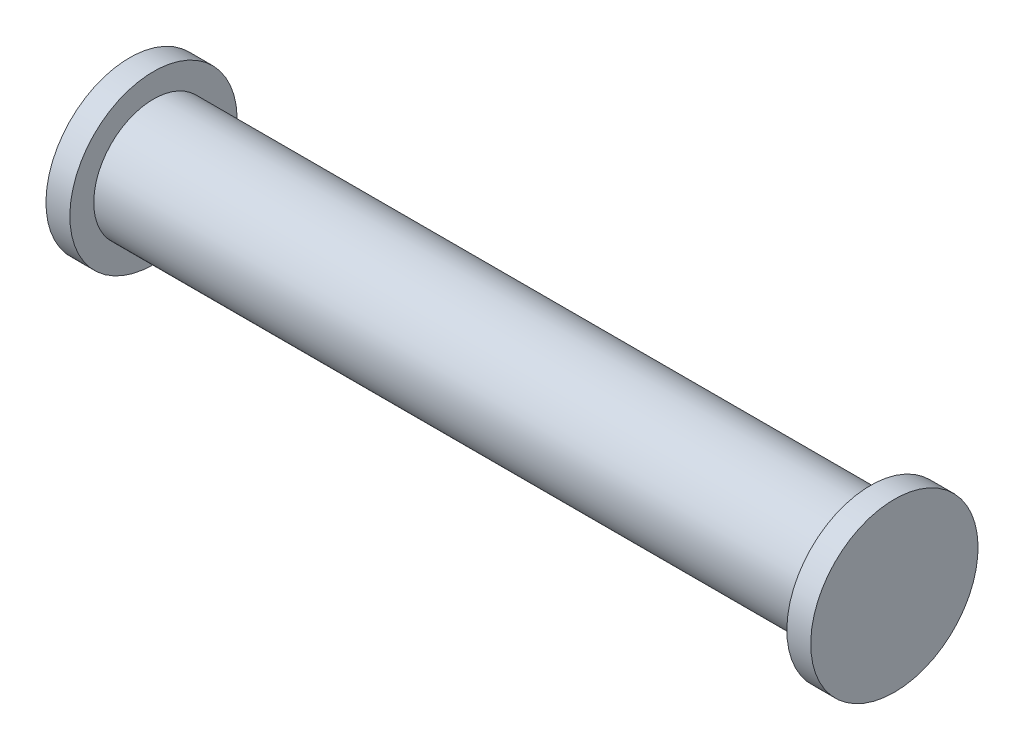
ISO-10303-21;
HEADER;
FILE_DESCRIPTION(('STEP AP214'),'2;1');
FILE_NAME('part.step','',(''),(''),'','','');
FILE_SCHEMA(('AUTOMOTIVE_DESIGN { 1 0 10303 214 1 1 1 1 }'));
ENDSEC;
DATA;
#1=APPLICATION_CONTEXT('core data for automotive mechanical design processes');
#2=APPLICATION_PROTOCOL_DEFINITION('international standard','automotive_design',2000,#1);
#3=PRODUCT_CONTEXT('',#1,'mechanical');
#4=PRODUCT('Part','Part','',(#3));
#5=PRODUCT_RELATED_PRODUCT_CATEGORY('part','',(#4));
#6=PRODUCT_DEFINITION_FORMATION('','',#4);
#7=PRODUCT_DEFINITION_CONTEXT('part definition',#1,'design');
#8=PRODUCT_DEFINITION('design','',#6,#7);
#9=PRODUCT_DEFINITION_SHAPE('','',#8);
#10=(LENGTH_UNIT() NAMED_UNIT(*) SI_UNIT(.MILLI.,.METRE.));
#11=(NAMED_UNIT(*) PLANE_ANGLE_UNIT() SI_UNIT($,.RADIAN.));
#12=(NAMED_UNIT(*) SI_UNIT($,.STERADIAN.) SOLID_ANGLE_UNIT());
#13=UNCERTAINTY_MEASURE_WITH_UNIT(LENGTH_MEASURE(1.E-05),#10,'distance_accuracy_value','');
#14=(GEOMETRIC_REPRESENTATION_CONTEXT(3) GLOBAL_UNCERTAINTY_ASSIGNED_CONTEXT((#13)) GLOBAL_UNIT_ASSIGNED_CONTEXT((#10,
#11,#12)) REPRESENTATION_CONTEXT('',''));
#15=CARTESIAN_POINT('',(0.,0.,0.));
#16=DIRECTION('',(0.,0.,1.));
#17=DIRECTION('',(1.,0.,0.));
#18=AXIS2_PLACEMENT_3D('',#15,#16,#17);
#19=CARTESIAN_POINT('',(30.,7.,0.));
#20=DIRECTION('',(1.,0.,0.));
#21=DIRECTION('',(0.,1.,0.));
#22=AXIS2_PLACEMENT_3D('',#19,#20,#21);
#23=PLANE('',#22);
#24=CARTESIAN_POINT('',(30.,0.,0.));
#25=DIRECTION('',(-1.,0.,0.));
#26=DIRECTION('',(0.,-1.,0.));
#27=AXIS2_PLACEMENT_3D('',#24,#25,#26);
#28=CIRCLE('',#27,5.00000000000001);
#29=CARTESIAN_POINT('',(30.,-5.00000000000001,0.));
#30=VERTEX_POINT('',#29);
#31=EDGE_CURVE('E10',#30,#30,#28,.T.);
#32=ORIENTED_EDGE('',*,*,#31,.F.);
#33=EDGE_LOOP('',(#32));
#34=FACE_BOUND('',#33,.T.);
#35=CARTESIAN_POINT('',(30.,0.,0.));
#36=DIRECTION('',(-1.,0.,0.));
#37=DIRECTION('',(0.,-1.,0.));
#38=AXIS2_PLACEMENT_3D('',#35,#36,#37);
#39=CIRCLE('',#38,7.);
#40=CARTESIAN_POINT('',(30.,-7.,0.));
#41=VERTEX_POINT('',#40);
#42=EDGE_CURVE('E52',#41,#41,#39,.T.);
#43=ORIENTED_EDGE('',*,*,#42,.T.);
#44=EDGE_LOOP('',(#43));
#45=FACE_BOUND('',#44,.T.);
#46=ADVANCED_FACE('F30',(#34,#45),#23,.F.);
#47=CARTESIAN_POINT('',(-32.,0.,0.));
#48=DIRECTION('',(-1.,0.,0.));
#49=DIRECTION('',(0.,-1.,0.));
#50=AXIS2_PLACEMENT_3D('',#47,#48,#49);
#51=CYLINDRICAL_SURFACE('',#50,5.);
#52=CARTESIAN_POINT('',(-30.,0.,0.));
#53=DIRECTION('',(-1.,0.,0.));
#54=DIRECTION('',(0.,-1.,0.));
#55=AXIS2_PLACEMENT_3D('',#52,#53,#54);
#56=CIRCLE('',#55,5.);
#57=CARTESIAN_POINT('',(-30.,-5.,0.));
#58=VERTEX_POINT('',#57);
#59=EDGE_CURVE('E36',#58,#58,#56,.T.);
#60=ORIENTED_EDGE('',*,*,#59,.F.);
#61=EDGE_LOOP('',(#60));
#62=FACE_BOUND('',#61,.T.);
#63=ORIENTED_EDGE('',*,*,#31,.T.);
#64=EDGE_LOOP('',(#63));
#65=FACE_BOUND('',#64,.T.);
#66=ADVANCED_FACE('F74',(#62,#65),#51,.T.);
#67=CARTESIAN_POINT('',(-30.,5.,0.));
#68=DIRECTION('',(-1.,0.,0.));
#69=DIRECTION('',(0.,-1.,0.));
#70=AXIS2_PLACEMENT_3D('',#67,#68,#69);
#71=PLANE('',#70);
#72=CARTESIAN_POINT('',(-30.,0.,0.));
#73=DIRECTION('',(-1.,0.,0.));
#74=DIRECTION('',(0.,-1.,0.));
#75=AXIS2_PLACEMENT_3D('',#72,#73,#74);
#76=CIRCLE('',#75,7.);
#77=CARTESIAN_POINT('',(-30.,-7.,0.));
#78=VERTEX_POINT('',#77);
#79=EDGE_CURVE('E40',#78,#78,#76,.T.);
#80=ORIENTED_EDGE('',*,*,#79,.F.);
#81=EDGE_LOOP('',(#80));
#82=FACE_BOUND('',#81,.T.);
#83=ORIENTED_EDGE('',*,*,#59,.T.);
#84=EDGE_LOOP('',(#83));
#85=FACE_BOUND('',#84,.T.);
#86=ADVANCED_FACE('F79',(#82,#85),#71,.F.);
#87=CARTESIAN_POINT('',(-32.,0.,0.));
#88=DIRECTION('',(-1.,0.,0.));
#89=DIRECTION('',(0.,-1.,0.));
#90=AXIS2_PLACEMENT_3D('',#87,#88,#89);
#91=CYLINDRICAL_SURFACE('',#90,7.);
#92=CARTESIAN_POINT('',(-32.,0.,0.));
#93=DIRECTION('',(-1.,0.,0.));
#94=DIRECTION('',(0.,-1.,0.));
#95=AXIS2_PLACEMENT_3D('',#92,#93,#94);
#96=CIRCLE('',#95,7.);
#97=CARTESIAN_POINT('',(-32.,-7.,0.));
#98=VERTEX_POINT('',#97);
#99=EDGE_CURVE('E44',#98,#98,#96,.T.);
#100=ORIENTED_EDGE('',*,*,#99,.F.);
#101=EDGE_LOOP('',(#100));
#102=FACE_BOUND('',#101,.T.);
#103=ORIENTED_EDGE('',*,*,#79,.T.);
#104=EDGE_LOOP('',(#103));
#105=FACE_BOUND('',#104,.T.);
#106=ADVANCED_FACE('F70',(#102,#105),#91,.T.);
#107=CARTESIAN_POINT('',(-32.,7.,0.));
#108=DIRECTION('',(1.,0.,0.));
#109=DIRECTION('',(0.,1.,0.));
#110=AXIS2_PLACEMENT_3D('',#107,#108,#109);
#111=PLANE('',#110);
#112=ORIENTED_EDGE('',*,*,#99,.T.);
#113=EDGE_LOOP('',(#112));
#114=FACE_BOUND('',#113,.T.);
#115=ADVANCED_FACE('F65',(#114),#111,.F.);
#116=CARTESIAN_POINT('',(32.,0.,0.));
#117=DIRECTION('',(-1.,0.,0.));
#118=DIRECTION('',(0.,-1.,0.));
#119=AXIS2_PLACEMENT_3D('',#116,#117,#118);
#120=PLANE('',#119);
#121=CARTESIAN_POINT('',(32.,0.,0.));
#122=DIRECTION('',(-1.,0.,0.));
#123=DIRECTION('',(0.,-1.,0.));
#124=AXIS2_PLACEMENT_3D('',#121,#122,#123);
#125=CIRCLE('',#124,7.);
#126=CARTESIAN_POINT('',(32.,-7.,0.));
#127=VERTEX_POINT('',#126);
#128=EDGE_CURVE('E49',#127,#127,#125,.T.);
#129=ORIENTED_EDGE('',*,*,#128,.F.);
#130=EDGE_LOOP('',(#129));
#131=FACE_BOUND('',#130,.T.);
#132=ADVANCED_FACE('F60',(#131),#120,.F.);
#133=CARTESIAN_POINT('',(-32.,0.,0.));
#134=DIRECTION('',(-1.,0.,0.));
#135=DIRECTION('',(0.,-1.,0.));
#136=AXIS2_PLACEMENT_3D('',#133,#134,#135);
#137=CYLINDRICAL_SURFACE('',#136,7.);
#138=ORIENTED_EDGE('',*,*,#42,.F.);
#139=EDGE_LOOP('',(#138));
#140=FACE_BOUND('',#139,.T.);
#141=ORIENTED_EDGE('',*,*,#128,.T.);
#142=EDGE_LOOP('',(#141));
#143=FACE_BOUND('',#142,.T.);
#144=ADVANCED_FACE('F57',(#140,#143),#137,.T.);
#145=CLOSED_SHELL('',(#46,#66,#86,#106,#115,#132,#144));
#146=MANIFOLD_SOLID_BREP('B2',#145);
#147=ADVANCED_BREP_SHAPE_REPRESENTATION('',(#18,#146),#14);
#148=SHAPE_DEFINITION_REPRESENTATION(#9,#147);
ENDSEC;
END-ISO-10303-21;
